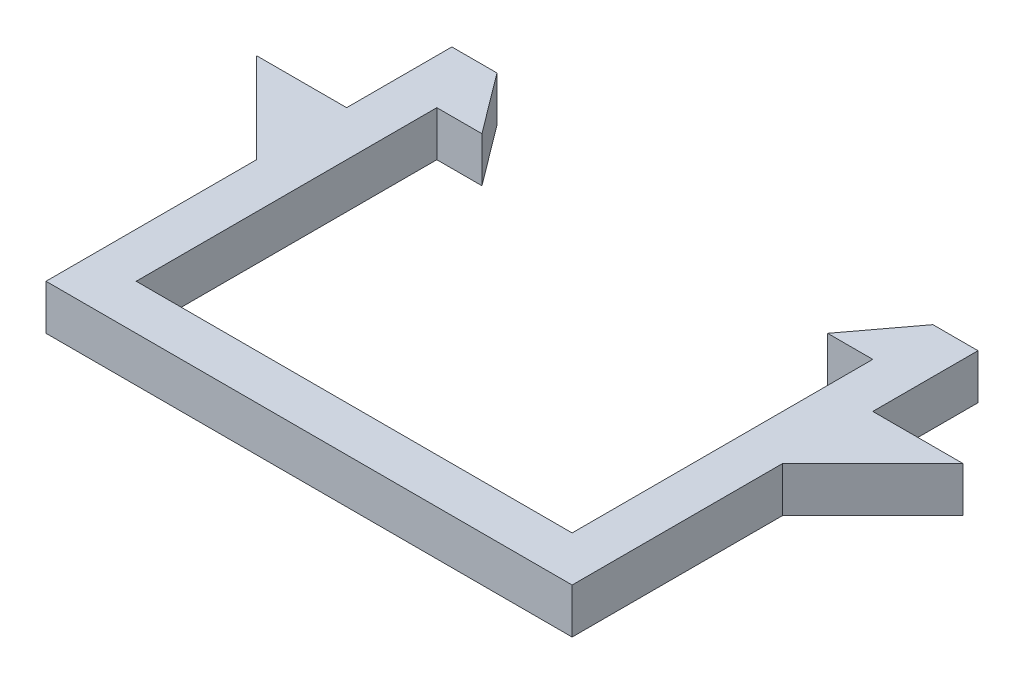
ISO-10303-21;
HEADER;
FILE_DESCRIPTION(('STEP AP214'),'2;1');
FILE_NAME('part.step','',(''),(''),'','','');
FILE_SCHEMA(('AUTOMOTIVE_DESIGN { 1 0 10303 214 1 1 1 1 }'));
ENDSEC;
DATA;
#1=APPLICATION_CONTEXT('core data for automotive mechanical design processes');
#2=APPLICATION_PROTOCOL_DEFINITION('international standard','automotive_design',2000,#1);
#3=PRODUCT_CONTEXT('',#1,'mechanical');
#4=PRODUCT('Part','Part','',(#3));
#5=PRODUCT_RELATED_PRODUCT_CATEGORY('part','',(#4));
#6=PRODUCT_DEFINITION_FORMATION('','',#4);
#7=PRODUCT_DEFINITION_CONTEXT('part definition',#1,'design');
#8=PRODUCT_DEFINITION('design','',#6,#7);
#9=PRODUCT_DEFINITION_SHAPE('','',#8);
#10=(LENGTH_UNIT() NAMED_UNIT(*) SI_UNIT(.MILLI.,.METRE.));
#11=(NAMED_UNIT(*) PLANE_ANGLE_UNIT() SI_UNIT($,.RADIAN.));
#12=(NAMED_UNIT(*) SI_UNIT($,.STERADIAN.) SOLID_ANGLE_UNIT());
#13=UNCERTAINTY_MEASURE_WITH_UNIT(LENGTH_MEASURE(1.E-05),#10,'distance_accuracy_value','');
#14=(GEOMETRIC_REPRESENTATION_CONTEXT(3) GLOBAL_UNCERTAINTY_ASSIGNED_CONTEXT((#13)) GLOBAL_UNIT_ASSIGNED_CONTEXT((#10,
#11,#12)) REPRESENTATION_CONTEXT('',''));
#15=CARTESIAN_POINT('',(0.,0.,0.));
#16=DIRECTION('',(0.,0.,1.));
#17=DIRECTION('',(1.,0.,0.));
#18=AXIS2_PLACEMENT_3D('',#15,#16,#17);
#19=CARTESIAN_POINT('',(-17.4999999999994,3.,0.));
#20=DIRECTION('',(1.,0.,0.));
#21=DIRECTION('',(0.,0.,-1.));
#22=AXIS2_PLACEMENT_3D('',#19,#20,#21);
#23=PLANE('',#22);
#24=DIRECTION('',(0.,0.,1.));
#25=VECTOR('',#24,1.);
#26=CARTESIAN_POINT('',(-17.4999999999994,0.,0.));
#27=LINE('',#26,#25);
#28=CARTESIAN_POINT('',(-17.4999999999994,0.,-14.));
#29=VERTEX_POINT('',#28);
#30=CARTESIAN_POINT('',(-17.4999999999994,0.,0.));
#31=VERTEX_POINT('',#30);
#32=EDGE_CURVE('E197',#29,#31,#27,.T.);
#33=ORIENTED_EDGE('',*,*,#32,.T.);
#34=DIRECTION('',(0.,-1.,0.));
#35=VECTOR('',#34,1.);
#36=CARTESIAN_POINT('',(-17.4999999999994,3.,0.));
#37=LINE('',#36,#35);
#38=CARTESIAN_POINT('',(-17.4999999999994,3.,0.));
#39=VERTEX_POINT('',#38);
#40=EDGE_CURVE('E11',#39,#31,#37,.T.);
#41=ORIENTED_EDGE('',*,*,#40,.F.);
#42=DIRECTION('',(0.,0.,1.));
#43=VECTOR('',#42,1.);
#44=CARTESIAN_POINT('',(-17.4999999999994,3.,0.));
#45=LINE('',#44,#43);
#46=CARTESIAN_POINT('',(-17.4999999999994,3.,-14.));
#47=VERTEX_POINT('',#46);
#48=EDGE_CURVE('E231',#47,#39,#45,.T.);
#49=ORIENTED_EDGE('',*,*,#48,.F.);
#50=DIRECTION('',(0.,-1.,0.));
#51=VECTOR('',#50,1.);
#52=CARTESIAN_POINT('',(-17.4999999999994,3.,-14.));
#53=LINE('',#52,#51);
#54=EDGE_CURVE('E193',#47,#29,#53,.T.);
#55=ORIENTED_EDGE('',*,*,#54,.T.);
#56=EDGE_LOOP('',(#33,#41,#49,#55));
#57=FACE_BOUND('',#56,.T.);
#58=ADVANCED_FACE('F41',(#57),#23,.F.);
#59=CARTESIAN_POINT('',(17.4999999999994,3.,-1.11022302462516E-13));
#60=DIRECTION('',(0.,0.,-1.));
#61=DIRECTION('',(-1.,0.,0.));
#62=AXIS2_PLACEMENT_3D('',#59,#60,#61);
#63=PLANE('',#62);
#64=DIRECTION('',(1.,0.,0.));
#65=VECTOR('',#64,1.);
#66=CARTESIAN_POINT('',(17.4999999999994,0.,-1.11022302462516E-13));
#67=LINE('',#66,#65);
#68=CARTESIAN_POINT('',(17.4999999999994,0.,-1.11022302462516E-13));
#69=VERTEX_POINT('',#68);
#70=EDGE_CURVE('E200',#31,#69,#67,.T.);
#71=ORIENTED_EDGE('',*,*,#70,.T.);
#72=DIRECTION('',(0.,-1.,0.));
#73=VECTOR('',#72,1.);
#74=CARTESIAN_POINT('',(17.4999999999994,3.,-1.11022302462516E-13));
#75=LINE('',#74,#73);
#76=CARTESIAN_POINT('',(17.4999999999994,3.,-1.11022302462516E-13));
#77=VERTEX_POINT('',#76);
#78=EDGE_CURVE('E49',#77,#69,#75,.T.);
#79=ORIENTED_EDGE('',*,*,#78,.F.);
#80=DIRECTION('',(1.,0.,0.));
#81=VECTOR('',#80,1.);
#82=CARTESIAN_POINT('',(17.4999999999994,3.,-1.11022302462516E-13));
#83=LINE('',#82,#81);
#84=EDGE_CURVE('E130',#39,#77,#83,.T.);
#85=ORIENTED_EDGE('',*,*,#84,.F.);
#86=ORIENTED_EDGE('',*,*,#40,.T.);
#87=EDGE_LOOP('',(#71,#79,#85,#86));
#88=FACE_BOUND('',#87,.T.);
#89=ADVANCED_FACE('F339',(#88),#63,.F.);
#90=CARTESIAN_POINT('',(17.4999999999994,3.,-1.11022302462516E-13));
#91=DIRECTION('',(-1.,0.,0.));
#92=DIRECTION('',(0.,0.,1.));
#93=AXIS2_PLACEMENT_3D('',#90,#91,#92);
#94=PLANE('',#93);
#95=DIRECTION('',(0.,0.,-1.));
#96=VECTOR('',#95,1.);
#97=CARTESIAN_POINT('',(17.4999999999994,0.,-1.11022302462516E-13));
#98=LINE('',#97,#96);
#99=CARTESIAN_POINT('',(17.4999999999993,0.,-14.0000000000001));
#100=VERTEX_POINT('',#99);
#101=EDGE_CURVE('E202',#69,#100,#98,.T.);
#102=ORIENTED_EDGE('',*,*,#101,.T.);
#103=DIRECTION('',(0.,-1.,0.));
#104=VECTOR('',#103,1.);
#105=CARTESIAN_POINT('',(17.4999999999993,3.,-14.0000000000001));
#106=LINE('',#105,#104);
#107=CARTESIAN_POINT('',(17.4999999999993,3.,-14.0000000000001));
#108=VERTEX_POINT('',#107);
#109=EDGE_CURVE('E268',#108,#100,#106,.T.);
#110=ORIENTED_EDGE('',*,*,#109,.F.);
#111=DIRECTION('',(0.,0.,-1.));
#112=VECTOR('',#111,1.);
#113=CARTESIAN_POINT('',(17.4999999999994,3.,-1.11022302462516E-13));
#114=LINE('',#113,#112);
#115=EDGE_CURVE('E276',#77,#108,#114,.T.);
#116=ORIENTED_EDGE('',*,*,#115,.F.);
#117=ORIENTED_EDGE('',*,*,#78,.T.);
#118=EDGE_LOOP('',(#102,#110,#116,#117));
#119=FACE_BOUND('',#118,.T.);
#120=ADVANCED_FACE('F274',(#119),#94,.F.);
#121=CARTESIAN_POINT('',(17.4999999999993,3.,-14.0000000000001));
#122=DIRECTION('',(-0.707106781186551,0.,-0.707106781186544));
#123=DIRECTION('',(-0.707106781186544,0.,0.707106781186551));
#124=AXIS2_PLACEMENT_3D('',#121,#122,#123);
#125=PLANE('',#124);
#126=DIRECTION('',(0.707106781186544,0.,-0.707106781186551));
#127=VECTOR('',#126,1.);
#128=CARTESIAN_POINT('',(17.4999999999993,0.,-14.0000000000001));
#129=LINE('',#128,#127);
#130=CARTESIAN_POINT('',(23.4999999999993,0.,-20.0000000000001));
#131=VERTEX_POINT('',#130);
#132=EDGE_CURVE('E204',#100,#131,#129,.T.);
#133=ORIENTED_EDGE('',*,*,#132,.T.);
#134=DIRECTION('',(0.,-1.,0.));
#135=VECTOR('',#134,1.);
#136=CARTESIAN_POINT('',(23.4999999999993,3.,-20.0000000000001));
#137=LINE('',#136,#135);
#138=CARTESIAN_POINT('',(23.4999999999993,3.,-20.0000000000001));
#139=VERTEX_POINT('',#138);
#140=EDGE_CURVE('E265',#139,#131,#137,.T.);
#141=ORIENTED_EDGE('',*,*,#140,.F.);
#142=DIRECTION('',(0.707106781186544,0.,-0.707106781186551));
#143=VECTOR('',#142,1.);
#144=CARTESIAN_POINT('',(17.4999999999993,3.,-14.0000000000001));
#145=LINE('',#144,#143);
#146=EDGE_CURVE('E294',#108,#139,#145,.T.);
#147=ORIENTED_EDGE('',*,*,#146,.F.);
#148=ORIENTED_EDGE('',*,*,#109,.T.);
#149=EDGE_LOOP('',(#133,#141,#147,#148));
#150=FACE_BOUND('',#149,.T.);
#151=ADVANCED_FACE('F285',(#150),#125,.F.);
#152=CARTESIAN_POINT('',(23.4999999999993,3.,-20.0000000000001));
#153=DIRECTION('',(0.,0.,1.));
#154=DIRECTION('',(1.,0.,0.));
#155=AXIS2_PLACEMENT_3D('',#152,#153,#154);
#156=PLANE('',#155);
#157=DIRECTION('',(-1.,0.,0.));
#158=VECTOR('',#157,1.);
#159=CARTESIAN_POINT('',(23.4999999999993,0.,-20.0000000000001));
#160=LINE('',#159,#158);
#161=CARTESIAN_POINT('',(17.4999999999993,0.,-20.0000000000001));
#162=VERTEX_POINT('',#161);
#163=EDGE_CURVE('E206',#131,#162,#160,.T.);
#164=ORIENTED_EDGE('',*,*,#163,.T.);
#165=DIRECTION('',(0.,-1.,0.));
#166=VECTOR('',#165,1.);
#167=CARTESIAN_POINT('',(17.4999999999993,3.,-20.0000000000001));
#168=LINE('',#167,#166);
#169=CARTESIAN_POINT('',(17.4999999999993,3.,-20.0000000000001));
#170=VERTEX_POINT('',#169);
#171=EDGE_CURVE('E262',#170,#162,#168,.T.);
#172=ORIENTED_EDGE('',*,*,#171,.F.);
#173=DIRECTION('',(-1.,0.,0.));
#174=VECTOR('',#173,1.);
#175=CARTESIAN_POINT('',(23.4999999999993,3.,-20.0000000000001));
#176=LINE('',#175,#174);
#177=EDGE_CURVE('E291',#139,#170,#176,.T.);
#178=ORIENTED_EDGE('',*,*,#177,.F.);
#179=ORIENTED_EDGE('',*,*,#140,.T.);
#180=EDGE_LOOP('',(#164,#172,#178,#179));
#181=FACE_BOUND('',#180,.T.);
#182=ADVANCED_FACE('F289',(#181),#156,.F.);
#183=CARTESIAN_POINT('',(17.4999999999993,3.,-20.0000000000001));
#184=DIRECTION('',(-1.,0.,0.));
#185=DIRECTION('',(0.,0.,1.));
#186=AXIS2_PLACEMENT_3D('',#183,#184,#185);
#187=PLANE('',#186);
#188=DIRECTION('',(0.,0.,-1.));
#189=VECTOR('',#188,1.);
#190=CARTESIAN_POINT('',(17.4999999999993,0.,-20.0000000000001));
#191=LINE('',#190,#189);
#192=CARTESIAN_POINT('',(17.4999999999992,0.,-27.0000000000001));
#193=VERTEX_POINT('',#192);
#194=EDGE_CURVE('E208',#162,#193,#191,.T.);
#195=ORIENTED_EDGE('',*,*,#194,.T.);
#196=DIRECTION('',(0.,-1.,0.));
#197=VECTOR('',#196,1.);
#198=CARTESIAN_POINT('',(17.4999999999992,3.,-27.0000000000001));
#199=LINE('',#198,#197);
#200=CARTESIAN_POINT('',(17.4999999999992,3.,-27.0000000000001));
#201=VERTEX_POINT('',#200);
#202=EDGE_CURVE('E259',#201,#193,#199,.T.);
#203=ORIENTED_EDGE('',*,*,#202,.F.);
#204=DIRECTION('',(0.,0.,-1.));
#205=VECTOR('',#204,1.);
#206=CARTESIAN_POINT('',(17.4999999999993,3.,-20.0000000000001));
#207=LINE('',#206,#205);
#208=EDGE_CURVE('E293',#170,#201,#207,.T.);
#209=ORIENTED_EDGE('',*,*,#208,.F.);
#210=ORIENTED_EDGE('',*,*,#171,.T.);
#211=EDGE_LOOP('',(#195,#203,#209,#210));
#212=FACE_BOUND('',#211,.T.);
#213=ADVANCED_FACE('F352',(#212),#187,.F.);
#214=CARTESIAN_POINT('',(17.4999999999992,3.,-27.0000000000001));
#215=DIRECTION('',(0.,0.,1.));
#216=DIRECTION('',(1.,0.,0.));
#217=AXIS2_PLACEMENT_3D('',#214,#215,#216);
#218=PLANE('',#217);
#219=DIRECTION('',(-1.,0.,0.));
#220=VECTOR('',#219,1.);
#221=CARTESIAN_POINT('',(17.4999999999992,0.,-27.0000000000001));
#222=LINE('',#221,#220);
#223=CARTESIAN_POINT('',(14.5000000000007,0.,-27.));
#224=VERTEX_POINT('',#223);
#225=EDGE_CURVE('E210',#193,#224,#222,.T.);
#226=ORIENTED_EDGE('',*,*,#225,.T.);
#227=DIRECTION('',(0.,-1.,0.));
#228=VECTOR('',#227,1.);
#229=CARTESIAN_POINT('',(14.5000000000007,3.,-27.));
#230=LINE('',#229,#228);
#231=CARTESIAN_POINT('',(14.5000000000007,3.,-27.));
#232=VERTEX_POINT('',#231);
#233=EDGE_CURVE('E256',#232,#224,#230,.T.);
#234=ORIENTED_EDGE('',*,*,#233,.F.);
#235=DIRECTION('',(-1.,0.,0.));
#236=VECTOR('',#235,1.);
#237=CARTESIAN_POINT('',(17.4999999999992,3.,-27.0000000000001));
#238=LINE('',#237,#236);
#239=EDGE_CURVE('E296',#201,#232,#238,.T.);
#240=ORIENTED_EDGE('',*,*,#239,.F.);
#241=ORIENTED_EDGE('',*,*,#202,.T.);
#242=EDGE_LOOP('',(#226,#234,#240,#241));
#243=FACE_BOUND('',#242,.T.);
#244=ADVANCED_FACE('F355',(#243),#218,.F.);
#245=CARTESIAN_POINT('',(14.5000000000007,3.,-27.));
#246=DIRECTION('',(0.799999999999856,0.,0.600000000000192));
#247=DIRECTION('',(0.600000000000192,0.,-0.799999999999856));
#248=AXIS2_PLACEMENT_3D('',#245,#246,#247);
#249=PLANE('',#248);
#250=DIRECTION('',(-0.600000000000192,0.,0.799999999999856));
#251=VECTOR('',#250,1.);
#252=CARTESIAN_POINT('',(14.5000000000007,0.,-27.));
#253=LINE('',#252,#251);
#254=CARTESIAN_POINT('',(11.4999999999992,0.,-23.));
#255=VERTEX_POINT('',#254);
#256=EDGE_CURVE('E212',#224,#255,#253,.T.);
#257=ORIENTED_EDGE('',*,*,#256,.T.);
#258=DIRECTION('',(0.,-1.,0.));
#259=VECTOR('',#258,1.);
#260=CARTESIAN_POINT('',(11.4999999999992,3.,-23.));
#261=LINE('',#260,#259);
#262=CARTESIAN_POINT('',(11.4999999999992,3.,-23.));
#263=VERTEX_POINT('',#262);
#264=EDGE_CURVE('E253',#263,#255,#261,.T.);
#265=ORIENTED_EDGE('',*,*,#264,.F.);
#266=DIRECTION('',(-0.600000000000192,0.,0.799999999999856));
#267=VECTOR('',#266,1.);
#268=CARTESIAN_POINT('',(14.5000000000007,3.,-27.));
#269=LINE('',#268,#267);
#270=EDGE_CURVE('E302',#232,#263,#269,.T.);
#271=ORIENTED_EDGE('',*,*,#270,.F.);
#272=ORIENTED_EDGE('',*,*,#233,.T.);
#273=EDGE_LOOP('',(#257,#265,#271,#272));
#274=FACE_BOUND('',#273,.T.);
#275=ADVANCED_FACE('F359',(#274),#249,.F.);
#276=CARTESIAN_POINT('',(11.4999999999992,3.,-23.));
#277=DIRECTION('',(0.,0.,-1.));
#278=DIRECTION('',(-1.,0.,0.));
#279=AXIS2_PLACEMENT_3D('',#276,#277,#278);
#280=PLANE('',#279);
#281=DIRECTION('',(1.,0.,0.));
#282=VECTOR('',#281,1.);
#283=CARTESIAN_POINT('',(11.4999999999992,0.,-23.));
#284=LINE('',#283,#282);
#285=CARTESIAN_POINT('',(14.4999999999992,0.,-23.0000000000001));
#286=VERTEX_POINT('',#285);
#287=EDGE_CURVE('E214',#255,#286,#284,.T.);
#288=ORIENTED_EDGE('',*,*,#287,.T.);
#289=DIRECTION('',(0.,-1.,0.));
#290=VECTOR('',#289,1.);
#291=CARTESIAN_POINT('',(14.4999999999992,3.,-23.0000000000001));
#292=LINE('',#291,#290);
#293=CARTESIAN_POINT('',(14.4999999999992,3.,-23.0000000000001));
#294=VERTEX_POINT('',#293);
#295=EDGE_CURVE('E250',#294,#286,#292,.T.);
#296=ORIENTED_EDGE('',*,*,#295,.F.);
#297=DIRECTION('',(1.,0.,0.));
#298=VECTOR('',#297,1.);
#299=CARTESIAN_POINT('',(11.4999999999992,3.,-23.));
#300=LINE('',#299,#298);
#301=EDGE_CURVE('E304',#263,#294,#300,.T.);
#302=ORIENTED_EDGE('',*,*,#301,.F.);
#303=ORIENTED_EDGE('',*,*,#264,.T.);
#304=EDGE_LOOP('',(#288,#296,#302,#303));
#305=FACE_BOUND('',#304,.T.);
#306=ADVANCED_FACE('F363',(#305),#280,.F.);
#307=CARTESIAN_POINT('',(14.4999999999992,3.,-23.0000000000001));
#308=DIRECTION('',(1.,0.,0.));
#309=DIRECTION('',(0.,0.,-1.));
#310=AXIS2_PLACEMENT_3D('',#307,#308,#309);
#311=PLANE('',#310);
#312=DIRECTION('',(0.,0.,1.));
#313=VECTOR('',#312,1.);
#314=CARTESIAN_POINT('',(14.4999999999992,0.,-23.0000000000001));
#315=LINE('',#314,#313);
#316=CARTESIAN_POINT('',(14.4999999999994,0.,-3.00000000000011));
#317=VERTEX_POINT('',#316);
#318=EDGE_CURVE('E216',#286,#317,#315,.T.);
#319=ORIENTED_EDGE('',*,*,#318,.T.);
#320=DIRECTION('',(0.,-1.,0.));
#321=VECTOR('',#320,1.);
#322=CARTESIAN_POINT('',(14.4999999999994,3.,-3.00000000000011));
#323=LINE('',#322,#321);
#324=CARTESIAN_POINT('',(14.4999999999994,3.,-3.00000000000011));
#325=VERTEX_POINT('',#324);
#326=EDGE_CURVE('E247',#325,#317,#323,.T.);
#327=ORIENTED_EDGE('',*,*,#326,.F.);
#328=DIRECTION('',(0.,0.,1.));
#329=VECTOR('',#328,1.);
#330=CARTESIAN_POINT('',(14.4999999999992,3.,-23.0000000000001));
#331=LINE('',#330,#329);
#332=EDGE_CURVE('E306',#294,#325,#331,.T.);
#333=ORIENTED_EDGE('',*,*,#332,.F.);
#334=ORIENTED_EDGE('',*,*,#295,.T.);
#335=EDGE_LOOP('',(#319,#327,#333,#334));
#336=FACE_BOUND('',#335,.T.);
#337=ADVANCED_FACE('F367',(#336),#311,.F.);
#338=CARTESIAN_POINT('',(-14.4999999999994,3.,-3.));
#339=DIRECTION('',(0.,0.,1.));
#340=DIRECTION('',(1.,0.,0.));
#341=AXIS2_PLACEMENT_3D('',#338,#339,#340);
#342=PLANE('',#341);
#343=DIRECTION('',(-1.,0.,0.));
#344=VECTOR('',#343,1.);
#345=CARTESIAN_POINT('',(-14.4999999999994,0.,-3.));
#346=LINE('',#345,#344);
#347=CARTESIAN_POINT('',(-14.4999999999994,0.,-3.));
#348=VERTEX_POINT('',#347);
#349=EDGE_CURVE('E218',#317,#348,#346,.T.);
#350=ORIENTED_EDGE('',*,*,#349,.T.);
#351=DIRECTION('',(0.,-1.,0.));
#352=VECTOR('',#351,1.);
#353=CARTESIAN_POINT('',(-14.4999999999994,3.,-3.));
#354=LINE('',#353,#352);
#355=CARTESIAN_POINT('',(-14.4999999999994,3.,-3.));
#356=VERTEX_POINT('',#355);
#357=EDGE_CURVE('E244',#356,#348,#354,.T.);
#358=ORIENTED_EDGE('',*,*,#357,.F.);
#359=DIRECTION('',(-1.,0.,0.));
#360=VECTOR('',#359,1.);
#361=CARTESIAN_POINT('',(-14.4999999999994,3.,-3.));
#362=LINE('',#361,#360);
#363=EDGE_CURVE('E308',#325,#356,#362,.T.);
#364=ORIENTED_EDGE('',*,*,#363,.F.);
#365=ORIENTED_EDGE('',*,*,#326,.T.);
#366=EDGE_LOOP('',(#350,#358,#364,#365));
#367=FACE_BOUND('',#366,.T.);
#368=ADVANCED_FACE('F371',(#367),#342,.F.);
#369=CARTESIAN_POINT('',(-14.4999999999994,3.,-23.));
#370=DIRECTION('',(-1.,0.,0.));
#371=DIRECTION('',(0.,0.,1.));
#372=AXIS2_PLACEMENT_3D('',#369,#370,#371);
#373=PLANE('',#372);
#374=DIRECTION('',(0.,0.,-1.));
#375=VECTOR('',#374,1.);
#376=CARTESIAN_POINT('',(-14.4999999999994,0.,-23.));
#377=LINE('',#376,#375);
#378=CARTESIAN_POINT('',(-14.4999999999994,0.,-23.));
#379=VERTEX_POINT('',#378);
#380=EDGE_CURVE('E220',#348,#379,#377,.T.);
#381=ORIENTED_EDGE('',*,*,#380,.T.);
#382=DIRECTION('',(0.,-1.,0.));
#383=VECTOR('',#382,1.);
#384=CARTESIAN_POINT('',(-14.4999999999994,3.,-23.));
#385=LINE('',#384,#383);
#386=CARTESIAN_POINT('',(-14.4999999999994,3.,-23.));
#387=VERTEX_POINT('',#386);
#388=EDGE_CURVE('E241',#387,#379,#385,.T.);
#389=ORIENTED_EDGE('',*,*,#388,.F.);
#390=DIRECTION('',(0.,0.,-1.));
#391=VECTOR('',#390,1.);
#392=CARTESIAN_POINT('',(-14.4999999999994,3.,-23.));
#393=LINE('',#392,#391);
#394=EDGE_CURVE('E310',#356,#387,#393,.T.);
#395=ORIENTED_EDGE('',*,*,#394,.F.);
#396=ORIENTED_EDGE('',*,*,#357,.T.);
#397=EDGE_LOOP('',(#381,#389,#395,#396));
#398=FACE_BOUND('',#397,.T.);
#399=ADVANCED_FACE('F375',(#398),#373,.F.);
#400=CARTESIAN_POINT('',(-11.4999999999994,3.,-23.));
#401=DIRECTION('',(0.,0.,-1.));
#402=DIRECTION('',(-1.,0.,0.));
#403=AXIS2_PLACEMENT_3D('',#400,#401,#402);
#404=PLANE('',#403);
#405=DIRECTION('',(1.,0.,0.));
#406=VECTOR('',#405,1.);
#407=CARTESIAN_POINT('',(-11.4999999999994,0.,-23.));
#408=LINE('',#407,#406);
#409=CARTESIAN_POINT('',(-11.4999999999994,0.,-23.));
#410=VERTEX_POINT('',#409);
#411=EDGE_CURVE('E222',#379,#410,#408,.T.);
#412=ORIENTED_EDGE('',*,*,#411,.T.);
#413=DIRECTION('',(0.,-1.,0.));
#414=VECTOR('',#413,1.);
#415=CARTESIAN_POINT('',(-11.4999999999994,3.,-23.));
#416=LINE('',#415,#414);
#417=CARTESIAN_POINT('',(-11.4999999999994,3.,-23.));
#418=VERTEX_POINT('',#417);
#419=EDGE_CURVE('E238',#418,#410,#416,.T.);
#420=ORIENTED_EDGE('',*,*,#419,.F.);
#421=DIRECTION('',(1.,0.,0.));
#422=VECTOR('',#421,1.);
#423=CARTESIAN_POINT('',(-11.4999999999994,3.,-23.));
#424=LINE('',#423,#422);
#425=EDGE_CURVE('E312',#387,#418,#424,.T.);
#426=ORIENTED_EDGE('',*,*,#425,.F.);
#427=ORIENTED_EDGE('',*,*,#388,.T.);
#428=EDGE_LOOP('',(#412,#420,#426,#427));
#429=FACE_BOUND('',#428,.T.);
#430=ADVANCED_FACE('F379',(#429),#404,.F.);
#431=CARTESIAN_POINT('',(-14.4999999999994,3.,-27.));
#432=DIRECTION('',(-0.8,0.,0.6));
#433=DIRECTION('',(0.6,0.,0.8));
#434=AXIS2_PLACEMENT_3D('',#431,#432,#433);
#435=PLANE('',#434);
#436=DIRECTION('',(-0.6,0.,-0.8));
#437=VECTOR('',#436,1.);
#438=CARTESIAN_POINT('',(-14.4999999999994,0.,-27.));
#439=LINE('',#438,#437);
#440=CARTESIAN_POINT('',(-14.4999999999994,0.,-27.));
#441=VERTEX_POINT('',#440);
#442=EDGE_CURVE('E224',#410,#441,#439,.T.);
#443=ORIENTED_EDGE('',*,*,#442,.T.);
#444=DIRECTION('',(0.,-1.,0.));
#445=VECTOR('',#444,1.);
#446=CARTESIAN_POINT('',(-14.4999999999994,3.,-27.));
#447=LINE('',#446,#445);
#448=CARTESIAN_POINT('',(-14.4999999999994,3.,-27.));
#449=VERTEX_POINT('',#448);
#450=EDGE_CURVE('E235',#449,#441,#447,.T.);
#451=ORIENTED_EDGE('',*,*,#450,.F.);
#452=DIRECTION('',(-0.6,0.,-0.8));
#453=VECTOR('',#452,1.);
#454=CARTESIAN_POINT('',(-14.4999999999994,3.,-27.));
#455=LINE('',#454,#453);
#456=EDGE_CURVE('E314',#418,#449,#455,.T.);
#457=ORIENTED_EDGE('',*,*,#456,.F.);
#458=ORIENTED_EDGE('',*,*,#419,.T.);
#459=EDGE_LOOP('',(#443,#451,#457,#458));
#460=FACE_BOUND('',#459,.T.);
#461=ADVANCED_FACE('F320',(#460),#435,.F.);
#462=CARTESIAN_POINT('',(-17.4999999999994,3.,-27.));
#463=DIRECTION('',(0.,0.,1.));
#464=DIRECTION('',(1.,0.,0.));
#465=AXIS2_PLACEMENT_3D('',#462,#463,#464);
#466=PLANE('',#465);
#467=DIRECTION('',(-1.,0.,0.));
#468=VECTOR('',#467,1.);
#469=CARTESIAN_POINT('',(-17.4999999999994,0.,-27.));
#470=LINE('',#469,#468);
#471=CARTESIAN_POINT('',(-17.4999999999994,0.,-27.));
#472=VERTEX_POINT('',#471);
#473=EDGE_CURVE('E226',#441,#472,#470,.T.);
#474=ORIENTED_EDGE('',*,*,#473,.T.);
#475=DIRECTION('',(0.,-1.,0.));
#476=VECTOR('',#475,1.);
#477=CARTESIAN_POINT('',(-17.4999999999994,3.,-27.));
#478=LINE('',#477,#476);
#479=CARTESIAN_POINT('',(-17.4999999999994,3.,-27.));
#480=VERTEX_POINT('',#479);
#481=EDGE_CURVE('E188',#480,#472,#478,.T.);
#482=ORIENTED_EDGE('',*,*,#481,.F.);
#483=DIRECTION('',(-1.,0.,0.));
#484=VECTOR('',#483,1.);
#485=CARTESIAN_POINT('',(-17.4999999999994,3.,-27.));
#486=LINE('',#485,#484);
#487=EDGE_CURVE('E179',#449,#480,#486,.T.);
#488=ORIENTED_EDGE('',*,*,#487,.F.);
#489=ORIENTED_EDGE('',*,*,#450,.T.);
#490=EDGE_LOOP('',(#474,#482,#488,#489));
#491=FACE_BOUND('',#490,.T.);
#492=ADVANCED_FACE('F324',(#491),#466,.F.);
#493=CARTESIAN_POINT('',(-17.4999999999994,3.,-20.));
#494=DIRECTION('',(1.,0.,0.));
#495=DIRECTION('',(0.,0.,-1.));
#496=AXIS2_PLACEMENT_3D('',#493,#494,#495);
#497=PLANE('',#496);
#498=DIRECTION('',(0.,0.,1.));
#499=VECTOR('',#498,1.);
#500=CARTESIAN_POINT('',(-17.4999999999994,0.,-20.));
#501=LINE('',#500,#499);
#502=CARTESIAN_POINT('',(-17.4999999999994,0.,-20.));
#503=VERTEX_POINT('',#502);
#504=EDGE_CURVE('E187',#472,#503,#501,.T.);
#505=ORIENTED_EDGE('',*,*,#504,.T.);
#506=DIRECTION('',(0.,-1.,0.));
#507=VECTOR('',#506,1.);
#508=CARTESIAN_POINT('',(-17.4999999999994,3.,-20.));
#509=LINE('',#508,#507);
#510=CARTESIAN_POINT('',(-17.4999999999994,3.,-20.));
#511=VERTEX_POINT('',#510);
#512=EDGE_CURVE('E184',#511,#503,#509,.T.);
#513=ORIENTED_EDGE('',*,*,#512,.F.);
#514=DIRECTION('',(0.,0.,1.));
#515=VECTOR('',#514,1.);
#516=CARTESIAN_POINT('',(-17.4999999999994,3.,-20.));
#517=LINE('',#516,#515);
#518=EDGE_CURVE('E173',#480,#511,#517,.T.);
#519=ORIENTED_EDGE('',*,*,#518,.F.);
#520=ORIENTED_EDGE('',*,*,#481,.T.);
#521=EDGE_LOOP('',(#505,#513,#519,#520));
#522=FACE_BOUND('',#521,.T.);
#523=ADVANCED_FACE('F185',(#522),#497,.F.);
#524=CARTESIAN_POINT('',(-23.4999999999994,3.,-20.));
#525=DIRECTION('',(0.,0.,1.));
#526=DIRECTION('',(1.,0.,0.));
#527=AXIS2_PLACEMENT_3D('',#524,#525,#526);
#528=PLANE('',#527);
#529=DIRECTION('',(-1.,0.,0.));
#530=VECTOR('',#529,1.);
#531=CARTESIAN_POINT('',(-23.4999999999994,0.,-20.));
#532=LINE('',#531,#530);
#533=CARTESIAN_POINT('',(-23.4999999999994,0.,-20.));
#534=VERTEX_POINT('',#533);
#535=EDGE_CURVE('E116',#503,#534,#532,.T.);
#536=ORIENTED_EDGE('',*,*,#535,.T.);
#537=DIRECTION('',(0.,-1.,0.));
#538=VECTOR('',#537,1.);
#539=CARTESIAN_POINT('',(-23.4999999999994,3.,-20.));
#540=LINE('',#539,#538);
#541=CARTESIAN_POINT('',(-23.4999999999994,3.,-20.));
#542=VERTEX_POINT('',#541);
#543=EDGE_CURVE('E189',#542,#534,#540,.T.);
#544=ORIENTED_EDGE('',*,*,#543,.F.);
#545=DIRECTION('',(-1.,0.,0.));
#546=VECTOR('',#545,1.);
#547=CARTESIAN_POINT('',(-23.4999999999994,3.,-20.));
#548=LINE('',#547,#546);
#549=EDGE_CURVE('E177',#511,#542,#548,.T.);
#550=ORIENTED_EDGE('',*,*,#549,.F.);
#551=ORIENTED_EDGE('',*,*,#512,.T.);
#552=EDGE_LOOP('',(#536,#544,#550,#551));
#553=FACE_BOUND('',#552,.T.);
#554=ADVANCED_FACE('F191',(#553),#528,.F.);
#555=CARTESIAN_POINT('',(-17.4999999999994,3.,-14.));
#556=DIRECTION('',(0.707106781186545,0.,-0.70710678118655));
#557=DIRECTION('',(-0.70710678118655,0.,-0.707106781186545));
#558=AXIS2_PLACEMENT_3D('',#555,#556,#557);
#559=PLANE('',#558);
#560=DIRECTION('',(0.70710678118655,0.,0.707106781186545));
#561=VECTOR('',#560,1.);
#562=CARTESIAN_POINT('',(-17.4999999999994,0.,-14.));
#563=LINE('',#562,#561);
#564=EDGE_CURVE('E122',#534,#29,#563,.T.);
#565=ORIENTED_EDGE('',*,*,#564,.T.);
#566=ORIENTED_EDGE('',*,*,#54,.F.);
#567=DIRECTION('',(0.70710678118655,0.,0.707106781186545));
#568=VECTOR('',#567,1.);
#569=CARTESIAN_POINT('',(-17.4999999999994,3.,-14.));
#570=LINE('',#569,#568);
#571=EDGE_CURVE('E57',#542,#47,#570,.T.);
#572=ORIENTED_EDGE('',*,*,#571,.F.);
#573=ORIENTED_EDGE('',*,*,#543,.T.);
#574=EDGE_LOOP('',(#565,#566,#572,#573));
#575=FACE_BOUND('',#574,.T.);
#576=ADVANCED_FACE('F328',(#575),#559,.F.);
#577=CARTESIAN_POINT('',(0.,3.,0.));
#578=DIRECTION('',(0.,-1.,0.));
#579=DIRECTION('',(0.,0.,-1.));
#580=AXIS2_PLACEMENT_3D('',#577,#578,#579);
#581=PLANE('',#580);
#582=ORIENTED_EDGE('',*,*,#48,.T.);
#583=ORIENTED_EDGE('',*,*,#84,.T.);
#584=ORIENTED_EDGE('',*,*,#115,.T.);
#585=ORIENTED_EDGE('',*,*,#146,.T.);
#586=ORIENTED_EDGE('',*,*,#177,.T.);
#587=ORIENTED_EDGE('',*,*,#208,.T.);
#588=ORIENTED_EDGE('',*,*,#239,.T.);
#589=ORIENTED_EDGE('',*,*,#270,.T.);
#590=ORIENTED_EDGE('',*,*,#301,.T.);
#591=ORIENTED_EDGE('',*,*,#332,.T.);
#592=ORIENTED_EDGE('',*,*,#363,.T.);
#593=ORIENTED_EDGE('',*,*,#394,.T.);
#594=ORIENTED_EDGE('',*,*,#425,.T.);
#595=ORIENTED_EDGE('',*,*,#456,.T.);
#596=ORIENTED_EDGE('',*,*,#487,.T.);
#597=ORIENTED_EDGE('',*,*,#518,.T.);
#598=ORIENTED_EDGE('',*,*,#549,.T.);
#599=ORIENTED_EDGE('',*,*,#571,.T.);
#600=EDGE_LOOP('',(#582,#583,#584,#585,#586,#587,#588,#589,#590,#591,#592,#593,#594,#595,#596,
#597,#598,#599));
#601=FACE_BOUND('',#600,.T.);
#602=ADVANCED_FACE('F175',(#601),#581,.F.);
#603=CARTESIAN_POINT('',(0.,0.,0.));
#604=DIRECTION('',(0.,-1.,0.));
#605=DIRECTION('',(0.,0.,-1.));
#606=AXIS2_PLACEMENT_3D('',#603,#604,#605);
#607=PLANE('',#606);
#608=ORIENTED_EDGE('',*,*,#32,.F.);
#609=ORIENTED_EDGE('',*,*,#564,.F.);
#610=ORIENTED_EDGE('',*,*,#535,.F.);
#611=ORIENTED_EDGE('',*,*,#504,.F.);
#612=ORIENTED_EDGE('',*,*,#473,.F.);
#613=ORIENTED_EDGE('',*,*,#442,.F.);
#614=ORIENTED_EDGE('',*,*,#411,.F.);
#615=ORIENTED_EDGE('',*,*,#380,.F.);
#616=ORIENTED_EDGE('',*,*,#349,.F.);
#617=ORIENTED_EDGE('',*,*,#318,.F.);
#618=ORIENTED_EDGE('',*,*,#287,.F.);
#619=ORIENTED_EDGE('',*,*,#256,.F.);
#620=ORIENTED_EDGE('',*,*,#225,.F.);
#621=ORIENTED_EDGE('',*,*,#194,.F.);
#622=ORIENTED_EDGE('',*,*,#163,.F.);
#623=ORIENTED_EDGE('',*,*,#132,.F.);
#624=ORIENTED_EDGE('',*,*,#101,.F.);
#625=ORIENTED_EDGE('',*,*,#70,.F.);
#626=EDGE_LOOP('',(#608,#609,#610,#611,#612,#613,#614,#615,#616,#617,#618,#619,#620,#621,#622,
#623,#624,#625));
#627=FACE_BOUND('',#626,.T.);
#628=ADVANCED_FACE('F280',(#627),#607,.T.);
#629=CLOSED_SHELL('',(#58,#89,#120,#151,#182,#213,#244,#275,#306,#337,#368,#399,#430,#461,#492,
#523,#554,#576,#602,#628));
#630=MANIFOLD_SOLID_BREP('B2',#629);
#631=ADVANCED_BREP_SHAPE_REPRESENTATION('',(#18,#630),#14);
#632=SHAPE_DEFINITION_REPRESENTATION(#9,#631);
ENDSEC;
END-ISO-10303-21;
